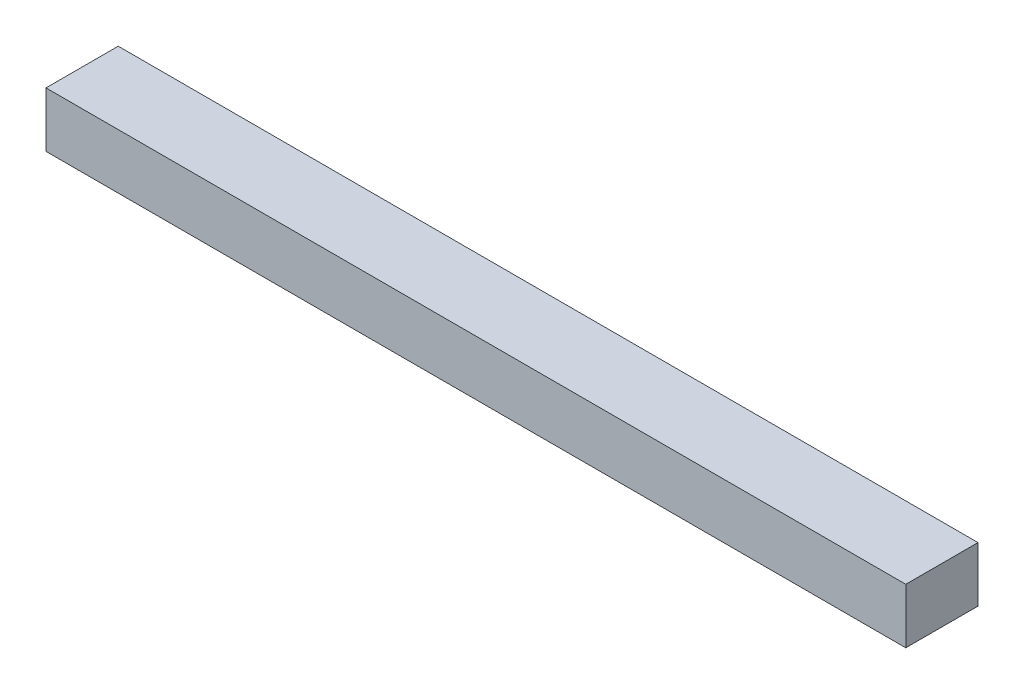
ISO-10303-21;
HEADER;
FILE_DESCRIPTION(('STEP AP214'),'2;1');
FILE_NAME('part.step','',(''),(''),'','','');
FILE_SCHEMA(('AUTOMOTIVE_DESIGN { 1 0 10303 214 1 1 1 1 }'));
ENDSEC;
DATA;
#1=APPLICATION_CONTEXT('core data for automotive mechanical design processes');
#2=APPLICATION_PROTOCOL_DEFINITION('international standard','automotive_design',2000,#1);
#3=PRODUCT_CONTEXT('',#1,'mechanical');
#4=PRODUCT('Part','Part','',(#3));
#5=PRODUCT_RELATED_PRODUCT_CATEGORY('part','',(#4));
#6=PRODUCT_DEFINITION_FORMATION('','',#4);
#7=PRODUCT_DEFINITION_CONTEXT('part definition',#1,'design');
#8=PRODUCT_DEFINITION('design','',#6,#7);
#9=PRODUCT_DEFINITION_SHAPE('','',#8);
#10=(LENGTH_UNIT() NAMED_UNIT(*) SI_UNIT(.MILLI.,.METRE.));
#11=(NAMED_UNIT(*) PLANE_ANGLE_UNIT() SI_UNIT($,.RADIAN.));
#12=(NAMED_UNIT(*) SI_UNIT($,.STERADIAN.) SOLID_ANGLE_UNIT());
#13=UNCERTAINTY_MEASURE_WITH_UNIT(LENGTH_MEASURE(1.E-05),#10,'distance_accuracy_value','');
#14=(GEOMETRIC_REPRESENTATION_CONTEXT(3) GLOBAL_UNCERTAINTY_ASSIGNED_CONTEXT((#13)) GLOBAL_UNIT_ASSIGNED_CONTEXT((#10,
#11,#12)) REPRESENTATION_CONTEXT('',''));
#15=CARTESIAN_POINT('',(0.,0.,0.));
#16=DIRECTION('',(0.,0.,1.));
#17=DIRECTION('',(1.,0.,0.));
#18=AXIS2_PLACEMENT_3D('',#15,#16,#17);
#19=CARTESIAN_POINT('',(-85.0515151515152,139.718484848485,210.));
#20=DIRECTION('',(1.,0.,0.));
#21=DIRECTION('',(0.,0.,-1.));
#22=AXIS2_PLACEMENT_3D('',#19,#20,#21);
#23=PLANE('',#22);
#24=DIRECTION('',(0.,-1.,0.));
#25=VECTOR('',#24,1.);
#26=CARTESIAN_POINT('',(-85.0515151515152,139.718484848485,0.));
#27=LINE('',#26,#25);
#28=CARTESIAN_POINT('',(-85.0515151515152,139.718484848485,0.));
#29=VERTEX_POINT('',#28);
#30=CARTESIAN_POINT('',(-85.0515151515152,-20.2815151515151,0.));
#31=VERTEX_POINT('',#30);
#32=EDGE_CURVE('E95',#29,#31,#27,.T.);
#33=ORIENTED_EDGE('',*,*,#32,.T.);
#34=DIRECTION('',(0.,0.,-1.));
#35=VECTOR('',#34,1.);
#36=CARTESIAN_POINT('',(-85.0515151515152,-20.2815151515151,210.));
#37=LINE('',#36,#35);
#38=CARTESIAN_POINT('',(-85.0515151515152,-20.2815151515151,210.));
#39=VERTEX_POINT('',#38);
#40=EDGE_CURVE('E11',#39,#31,#37,.T.);
#41=ORIENTED_EDGE('',*,*,#40,.F.);
#42=DIRECTION('',(0.,-1.,0.));
#43=VECTOR('',#42,1.);
#44=CARTESIAN_POINT('',(-85.0515151515152,139.718484848485,210.));
#45=LINE('',#44,#43);
#46=CARTESIAN_POINT('',(-85.0515151515152,139.718484848485,210.));
#47=VERTEX_POINT('',#46);
#48=EDGE_CURVE('E83',#47,#39,#45,.T.);
#49=ORIENTED_EDGE('',*,*,#48,.F.);
#50=DIRECTION('',(0.,0.,-1.));
#51=VECTOR('',#50,1.);
#52=CARTESIAN_POINT('',(-85.0515151515152,139.718484848485,210.));
#53=LINE('',#52,#51);
#54=EDGE_CURVE('E91',#47,#29,#53,.T.);
#55=ORIENTED_EDGE('',*,*,#54,.T.);
#56=EDGE_LOOP('',(#33,#41,#49,#55));
#57=FACE_BOUND('',#56,.T.);
#58=ADVANCED_FACE('F32',(#57),#23,.F.);
#59=CARTESIAN_POINT('',(-85.0515151515152,-20.2815151515151,210.));
#60=DIRECTION('',(0.,1.,0.));
#61=DIRECTION('',(0.,0.,1.));
#62=AXIS2_PLACEMENT_3D('',#59,#60,#61);
#63=PLANE('',#62);
#64=DIRECTION('',(1.,0.,0.));
#65=VECTOR('',#64,1.);
#66=CARTESIAN_POINT('',(-85.0515151515152,-20.2815151515151,0.));
#67=LINE('',#66,#65);
#68=CARTESIAN_POINT('',(2414.94848484848,-20.2815151515151,0.));
#69=VERTEX_POINT('',#68);
#70=EDGE_CURVE('E87',#31,#69,#67,.T.);
#71=ORIENTED_EDGE('',*,*,#70,.T.);
#72=DIRECTION('',(0.,0.,-1.));
#73=VECTOR('',#72,1.);
#74=CARTESIAN_POINT('',(2414.94848484848,-20.2815151515151,210.));
#75=LINE('',#74,#73);
#76=CARTESIAN_POINT('',(2414.94848484848,-20.2815151515151,210.));
#77=VERTEX_POINT('',#76);
#78=EDGE_CURVE('E40',#77,#69,#75,.T.);
#79=ORIENTED_EDGE('',*,*,#78,.F.);
#80=DIRECTION('',(1.,0.,0.));
#81=VECTOR('',#80,1.);
#82=CARTESIAN_POINT('',(-85.0515151515152,-20.2815151515151,210.));
#83=LINE('',#82,#81);
#84=EDGE_CURVE('E78',#39,#77,#83,.T.);
#85=ORIENTED_EDGE('',*,*,#84,.F.);
#86=ORIENTED_EDGE('',*,*,#40,.T.);
#87=EDGE_LOOP('',(#71,#79,#85,#86));
#88=FACE_BOUND('',#87,.T.);
#89=ADVANCED_FACE('F86',(#88),#63,.F.);
#90=CARTESIAN_POINT('',(2414.94848484848,139.718484848485,210.));
#91=DIRECTION('',(-1.,0.,0.));
#92=DIRECTION('',(0.,0.,1.));
#93=AXIS2_PLACEMENT_3D('',#90,#91,#92);
#94=PLANE('',#93);
#95=DIRECTION('',(0.,1.,0.));
#96=VECTOR('',#95,1.);
#97=CARTESIAN_POINT('',(2414.94848484848,139.718484848485,0.));
#98=LINE('',#97,#96);
#99=CARTESIAN_POINT('',(2414.94848484848,139.718484848485,0.));
#100=VERTEX_POINT('',#99);
#101=EDGE_CURVE('E65',#69,#100,#98,.T.);
#102=ORIENTED_EDGE('',*,*,#101,.T.);
#103=DIRECTION('',(0.,0.,-1.));
#104=VECTOR('',#103,1.);
#105=CARTESIAN_POINT('',(2414.94848484848,139.718484848485,210.));
#106=LINE('',#105,#104);
#107=CARTESIAN_POINT('',(2414.94848484848,139.718484848485,210.));
#108=VERTEX_POINT('',#107);
#109=EDGE_CURVE('E88',#108,#100,#106,.T.);
#110=ORIENTED_EDGE('',*,*,#109,.F.);
#111=DIRECTION('',(0.,1.,0.));
#112=VECTOR('',#111,1.);
#113=CARTESIAN_POINT('',(2414.94848484848,139.718484848485,210.));
#114=LINE('',#113,#112);
#115=EDGE_CURVE('E81',#77,#108,#114,.T.);
#116=ORIENTED_EDGE('',*,*,#115,.F.);
#117=ORIENTED_EDGE('',*,*,#78,.T.);
#118=EDGE_LOOP('',(#102,#110,#116,#117));
#119=FACE_BOUND('',#118,.T.);
#120=ADVANCED_FACE('F89',(#119),#94,.F.);
#121=CARTESIAN_POINT('',(-85.0515151515152,139.718484848485,210.));
#122=DIRECTION('',(0.,-1.,0.));
#123=DIRECTION('',(0.,0.,-1.));
#124=AXIS2_PLACEMENT_3D('',#121,#122,#123);
#125=PLANE('',#124);
#126=DIRECTION('',(-1.,0.,0.));
#127=VECTOR('',#126,1.);
#128=CARTESIAN_POINT('',(-85.0515151515152,139.718484848485,0.));
#129=LINE('',#128,#127);
#130=EDGE_CURVE('E71',#100,#29,#129,.T.);
#131=ORIENTED_EDGE('',*,*,#130,.T.);
#132=ORIENTED_EDGE('',*,*,#54,.F.);
#133=DIRECTION('',(-1.,0.,0.));
#134=VECTOR('',#133,1.);
#135=CARTESIAN_POINT('',(-85.0515151515152,139.718484848485,210.));
#136=LINE('',#135,#134);
#137=EDGE_CURVE('E48',#108,#47,#136,.T.);
#138=ORIENTED_EDGE('',*,*,#137,.F.);
#139=ORIENTED_EDGE('',*,*,#109,.T.);
#140=EDGE_LOOP('',(#131,#132,#138,#139));
#141=FACE_BOUND('',#140,.T.);
#142=ADVANCED_FACE('F102',(#141),#125,.F.);
#143=CARTESIAN_POINT('',(-85.0515151515152,-20.2815151515151,210.));
#144=DIRECTION('',(0.,0.,1.));
#145=DIRECTION('',(1.,0.,0.));
#146=AXIS2_PLACEMENT_3D('',#143,#144,#145);
#147=PLANE('',#146);
#148=ORIENTED_EDGE('',*,*,#48,.T.);
#149=ORIENTED_EDGE('',*,*,#84,.T.);
#150=ORIENTED_EDGE('',*,*,#115,.T.);
#151=ORIENTED_EDGE('',*,*,#137,.T.);
#152=EDGE_LOOP('',(#148,#149,#150,#151));
#153=FACE_BOUND('',#152,.T.);
#154=ADVANCED_FACE('F79',(#153),#147,.T.);
#155=CARTESIAN_POINT('',(-85.0515151515152,-20.2815151515151,0.));
#156=DIRECTION('',(0.,0.,1.));
#157=DIRECTION('',(1.,0.,0.));
#158=AXIS2_PLACEMENT_3D('',#155,#156,#157);
#159=PLANE('',#158);
#160=ORIENTED_EDGE('',*,*,#32,.F.);
#161=ORIENTED_EDGE('',*,*,#130,.F.);
#162=ORIENTED_EDGE('',*,*,#101,.F.);
#163=ORIENTED_EDGE('',*,*,#70,.F.);
#164=EDGE_LOOP('',(#160,#161,#162,#163));
#165=FACE_BOUND('',#164,.T.);
#166=ADVANCED_FACE('F105',(#165),#159,.F.);
#167=CLOSED_SHELL('',(#58,#89,#120,#142,#154,#166));
#168=MANIFOLD_SOLID_BREP('B2',#167);
#169=ADVANCED_BREP_SHAPE_REPRESENTATION('',(#18,#168),#14);
#170=SHAPE_DEFINITION_REPRESENTATION(#9,#169);
ENDSEC;
END-ISO-10303-21;
